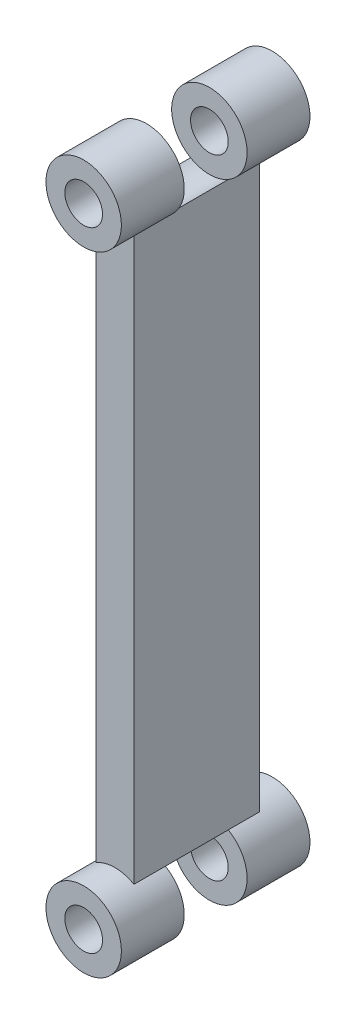
ISO-10303-21;
HEADER;
FILE_DESCRIPTION(('STEP AP214'),'2;1');
FILE_NAME('part.step','',(''),(''),'','','');
FILE_SCHEMA(('AUTOMOTIVE_DESIGN { 1 0 10303 214 1 1 1 1 }'));
ENDSEC;
DATA;
#1=APPLICATION_CONTEXT('core data for automotive mechanical design processes');
#2=APPLICATION_PROTOCOL_DEFINITION('international standard','automotive_design',2000,#1);
#3=PRODUCT_CONTEXT('',#1,'mechanical');
#4=PRODUCT('Part','Part','',(#3));
#5=PRODUCT_RELATED_PRODUCT_CATEGORY('part','',(#4));
#6=PRODUCT_DEFINITION_FORMATION('','',#4);
#7=PRODUCT_DEFINITION_CONTEXT('part definition',#1,'design');
#8=PRODUCT_DEFINITION('design','',#6,#7);
#9=PRODUCT_DEFINITION_SHAPE('','',#8);
#10=(LENGTH_UNIT() NAMED_UNIT(*) SI_UNIT(.MILLI.,.METRE.));
#11=(NAMED_UNIT(*) PLANE_ANGLE_UNIT() SI_UNIT($,.RADIAN.));
#12=(NAMED_UNIT(*) SI_UNIT($,.STERADIAN.) SOLID_ANGLE_UNIT());
#13=UNCERTAINTY_MEASURE_WITH_UNIT(LENGTH_MEASURE(1.E-05),#10,'distance_accuracy_value','');
#14=(GEOMETRIC_REPRESENTATION_CONTEXT(3) GLOBAL_UNCERTAINTY_ASSIGNED_CONTEXT((#13)) GLOBAL_UNIT_ASSIGNED_CONTEXT((#10,
#11,#12)) REPRESENTATION_CONTEXT('',''));
#15=CARTESIAN_POINT('',(0.,0.,0.));
#16=DIRECTION('',(0.,0.,1.));
#17=DIRECTION('',(1.,0.,0.));
#18=AXIS2_PLACEMENT_3D('',#15,#16,#17);
#19=CARTESIAN_POINT('',(0.,25.,2.5));
#20=DIRECTION('',(0.,0.,1.));
#21=DIRECTION('',(1.,0.,0.));
#22=AXIS2_PLACEMENT_3D('',#19,#20,#21);
#23=PLANE('',#22);
#24=CARTESIAN_POINT('',(0.,25.,2.5));
#25=DIRECTION('',(0.,0.,1.));
#26=DIRECTION('',(1.,0.,0.));
#27=AXIS2_PLACEMENT_3D('',#24,#25,#26);
#28=CIRCLE('',#27,3.);
#29=CARTESIAN_POINT('',(-1.5,22.4019237886467,2.5));
#30=VERTEX_POINT('',#29);
#31=CARTESIAN_POINT('',(1.5,22.4019237886467,2.5));
#32=VERTEX_POINT('',#31);
#33=EDGE_CURVE('E209',#30,#32,#28,.T.);
#34=ORIENTED_EDGE('',*,*,#33,.F.);
#35=EDGE_CURVE('E212',#32,#30,#28,.T.);
#36=ORIENTED_EDGE('',*,*,#35,.F.);
#37=EDGE_LOOP('',(#34,#36));
#38=FACE_BOUND('',#37,.T.);
#39=CARTESIAN_POINT('',(0.,25.,2.5));
#40=DIRECTION('',(0.,0.,1.));
#41=DIRECTION('',(1.,0.,0.));
#42=AXIS2_PLACEMENT_3D('',#39,#40,#41);
#43=CIRCLE('',#42,1.5);
#44=CARTESIAN_POINT('',(1.5,25.,2.5));
#45=VERTEX_POINT('',#44);
#46=EDGE_CURVE('E203',#45,#45,#43,.F.);
#47=ORIENTED_EDGE('',*,*,#46,.F.);
#48=EDGE_LOOP('',(#47));
#49=FACE_BOUND('',#48,.T.);
#50=ADVANCED_FACE('F56',(#38,#49),#23,.F.);
#51=CARTESIAN_POINT('',(0.,25.,-2.5));
#52=DIRECTION('',(0.,0.,1.));
#53=DIRECTION('',(1.,0.,0.));
#54=AXIS2_PLACEMENT_3D('',#51,#52,#53);
#55=PLANE('',#54);
#56=CARTESIAN_POINT('',(0.,25.,-2.5));
#57=DIRECTION('',(0.,0.,1.));
#58=DIRECTION('',(1.,0.,0.));
#59=AXIS2_PLACEMENT_3D('',#56,#57,#58);
#60=CIRCLE('',#59,3.);
#61=CARTESIAN_POINT('',(-1.5,22.4019237886467,-2.5));
#62=VERTEX_POINT('',#61);
#63=CARTESIAN_POINT('',(1.5,22.4019237886467,-2.5));
#64=VERTEX_POINT('',#63);
#65=EDGE_CURVE('E77',#62,#64,#60,.T.);
#66=ORIENTED_EDGE('',*,*,#65,.T.);
#67=EDGE_CURVE('E214',#64,#62,#60,.T.);
#68=ORIENTED_EDGE('',*,*,#67,.T.);
#69=EDGE_LOOP('',(#66,#68));
#70=FACE_BOUND('',#69,.T.);
#71=CARTESIAN_POINT('',(0.,25.,-2.5));
#72=DIRECTION('',(0.,0.,1.));
#73=DIRECTION('',(1.,0.,0.));
#74=AXIS2_PLACEMENT_3D('',#71,#72,#73);
#75=CIRCLE('',#74,1.5);
#76=CARTESIAN_POINT('',(1.5,25.,-2.5));
#77=VERTEX_POINT('',#76);
#78=EDGE_CURVE('E206',#77,#77,#75,.F.);
#79=ORIENTED_EDGE('',*,*,#78,.T.);
#80=EDGE_LOOP('',(#79));
#81=FACE_BOUND('',#80,.T.);
#82=ADVANCED_FACE('F227',(#70,#81),#55,.T.);
#83=CARTESIAN_POINT('',(0.,-25.,2.5));
#84=DIRECTION('',(0.,0.,1.));
#85=DIRECTION('',(1.,0.,0.));
#86=AXIS2_PLACEMENT_3D('',#83,#84,#85);
#87=PLANE('',#86);
#88=CARTESIAN_POINT('',(0.,-25.,2.5));
#89=DIRECTION('',(0.,0.,1.));
#90=DIRECTION('',(1.,0.,0.));
#91=AXIS2_PLACEMENT_3D('',#88,#89,#90);
#92=CIRCLE('',#91,3.);
#93=CARTESIAN_POINT('',(1.5,-22.4019237886467,2.5));
#94=VERTEX_POINT('',#93);
#95=CARTESIAN_POINT('',(-1.5,-22.4019237886467,2.5));
#96=VERTEX_POINT('',#95);
#97=EDGE_CURVE('E126',#94,#96,#92,.T.);
#98=ORIENTED_EDGE('',*,*,#97,.F.);
#99=EDGE_CURVE('E220',#96,#94,#92,.T.);
#100=ORIENTED_EDGE('',*,*,#99,.F.);
#101=EDGE_LOOP('',(#98,#100));
#102=FACE_BOUND('',#101,.T.);
#103=CARTESIAN_POINT('',(0.,-25.,2.5));
#104=DIRECTION('',(0.,0.,1.));
#105=DIRECTION('',(1.,0.,0.));
#106=AXIS2_PLACEMENT_3D('',#103,#104,#105);
#107=CIRCLE('',#106,1.50000000000001);
#108=CARTESIAN_POINT('',(1.50000000000001,-25.,2.5));
#109=VERTEX_POINT('',#108);
#110=EDGE_CURVE('E215',#109,#109,#107,.F.);
#111=ORIENTED_EDGE('',*,*,#110,.F.);
#112=EDGE_LOOP('',(#111));
#113=FACE_BOUND('',#112,.T.);
#114=ADVANCED_FACE('F224',(#102,#113),#87,.F.);
#115=CARTESIAN_POINT('',(0.,-25.,-2.5));
#116=DIRECTION('',(0.,0.,1.));
#117=DIRECTION('',(1.,0.,0.));
#118=AXIS2_PLACEMENT_3D('',#115,#116,#117);
#119=PLANE('',#118);
#120=CARTESIAN_POINT('',(0.,-25.,-2.5));
#121=DIRECTION('',(0.,0.,1.));
#122=DIRECTION('',(1.,0.,0.));
#123=AXIS2_PLACEMENT_3D('',#120,#121,#122);
#124=CIRCLE('',#123,3.);
#125=CARTESIAN_POINT('',(1.5,-22.4019237886467,-2.5));
#126=VERTEX_POINT('',#125);
#127=CARTESIAN_POINT('',(-1.5,-22.4019237886467,-2.5));
#128=VERTEX_POINT('',#127);
#129=EDGE_CURVE('E70',#126,#128,#124,.T.);
#130=ORIENTED_EDGE('',*,*,#129,.T.);
#131=EDGE_CURVE('E119',#128,#126,#124,.T.);
#132=ORIENTED_EDGE('',*,*,#131,.T.);
#133=EDGE_LOOP('',(#130,#132));
#134=FACE_BOUND('',#133,.T.);
#135=CARTESIAN_POINT('',(0.,-25.,-2.5));
#136=DIRECTION('',(0.,0.,1.));
#137=DIRECTION('',(1.,0.,0.));
#138=AXIS2_PLACEMENT_3D('',#135,#136,#137);
#139=CIRCLE('',#138,1.50000000000001);
#140=CARTESIAN_POINT('',(1.50000000000001,-25.,-2.5));
#141=VERTEX_POINT('',#140);
#142=EDGE_CURVE('E136',#141,#141,#139,.F.);
#143=ORIENTED_EDGE('',*,*,#142,.T.);
#144=EDGE_LOOP('',(#143));
#145=FACE_BOUND('',#144,.T.);
#146=ADVANCED_FACE('F120',(#134,#145),#119,.T.);
#147=CARTESIAN_POINT('',(0.,-25.,-7.5));
#148=DIRECTION('',(0.,0.,1.));
#149=DIRECTION('',(1.,0.,0.));
#150=AXIS2_PLACEMENT_3D('',#147,#148,#149);
#151=CYLINDRICAL_SURFACE('',#150,3.);
#152=CARTESIAN_POINT('',(0.,-25.,-7.5));
#153=DIRECTION('',(0.,0.,1.));
#154=DIRECTION('',(1.,0.,0.));
#155=AXIS2_PLACEMENT_3D('',#152,#153,#154);
#156=CIRCLE('',#155,3.);
#157=CARTESIAN_POINT('',(3.,-25.,-7.5));
#158=VERTEX_POINT('',#157);
#159=EDGE_CURVE('E161',#158,#158,#156,.T.);
#160=ORIENTED_EDGE('',*,*,#159,.T.);
#161=EDGE_LOOP('',(#160));
#162=FACE_BOUND('',#161,.T.);
#163=DIRECTION('',(0.,0.,1.));
#164=VECTOR('',#163,1.);
#165=CARTESIAN_POINT('',(1.5,-22.4019237886467,-7.5));
#166=LINE('',#165,#164);
#167=CARTESIAN_POINT('',(1.5,-22.4019237886467,-5.));
#168=VERTEX_POINT('',#167);
#169=EDGE_CURVE('E141',#168,#126,#166,.T.);
#170=ORIENTED_EDGE('',*,*,#169,.T.);
#171=ORIENTED_EDGE('',*,*,#131,.F.);
#172=DIRECTION('',(0.,0.,1.));
#173=VECTOR('',#172,1.);
#174=CARTESIAN_POINT('',(-1.5,-22.4019237886467,-7.5));
#175=LINE('',#174,#173);
#176=CARTESIAN_POINT('',(-1.5,-22.4019237886467,-5.));
#177=VERTEX_POINT('',#176);
#178=EDGE_CURVE('E152',#177,#128,#175,.T.);
#179=ORIENTED_EDGE('',*,*,#178,.F.);
#180=CARTESIAN_POINT('',(0.,-25.,-5.));
#181=DIRECTION('',(0.,0.,1.));
#182=DIRECTION('',(1.,0.,0.));
#183=AXIS2_PLACEMENT_3D('',#180,#181,#182);
#184=CIRCLE('',#183,3.);
#185=EDGE_CURVE('E148',#168,#177,#184,.T.);
#186=ORIENTED_EDGE('',*,*,#185,.F.);
#187=EDGE_LOOP('',(#170,#171,#179,#186));
#188=FACE_BOUND('',#187,.T.);
#189=ADVANCED_FACE('F147',(#162,#188),#151,.T.);
#190=CARTESIAN_POINT('',(0.,-25.,-7.5));
#191=DIRECTION('',(0.,0.,1.));
#192=DIRECTION('',(1.,0.,0.));
#193=AXIS2_PLACEMENT_3D('',#190,#191,#192);
#194=CYLINDRICAL_SURFACE('',#193,1.50000000000001);
#195=ORIENTED_EDGE('',*,*,#142,.F.);
#196=EDGE_LOOP('',(#195));
#197=FACE_BOUND('',#196,.T.);
#198=CARTESIAN_POINT('',(0.,-25.,-7.5));
#199=DIRECTION('',(0.,0.,1.));
#200=DIRECTION('',(1.,0.,0.));
#201=AXIS2_PLACEMENT_3D('',#198,#199,#200);
#202=CIRCLE('',#201,1.50000000000001);
#203=CARTESIAN_POINT('',(1.50000000000001,-25.,-7.5));
#204=VERTEX_POINT('',#203);
#205=EDGE_CURVE('E166',#204,#204,#202,.T.);
#206=ORIENTED_EDGE('',*,*,#205,.F.);
#207=EDGE_LOOP('',(#206));
#208=FACE_BOUND('',#207,.T.);
#209=ADVANCED_FACE('F236',(#197,#208),#194,.F.);
#210=CARTESIAN_POINT('',(0.,25.,-7.5));
#211=DIRECTION('',(0.,0.,1.));
#212=DIRECTION('',(1.,0.,0.));
#213=AXIS2_PLACEMENT_3D('',#210,#211,#212);
#214=CYLINDRICAL_SURFACE('',#213,3.);
#215=CARTESIAN_POINT('',(0.,25.,-7.5));
#216=DIRECTION('',(0.,0.,1.));
#217=DIRECTION('',(1.,0.,0.));
#218=AXIS2_PLACEMENT_3D('',#215,#216,#217);
#219=CIRCLE('',#218,3.);
#220=CARTESIAN_POINT('',(3.,25.,-7.5));
#221=VERTEX_POINT('',#220);
#222=EDGE_CURVE('E200',#221,#221,#219,.T.);
#223=ORIENTED_EDGE('',*,*,#222,.T.);
#224=EDGE_LOOP('',(#223));
#225=FACE_BOUND('',#224,.T.);
#226=DIRECTION('',(0.,0.,1.));
#227=VECTOR('',#226,1.);
#228=CARTESIAN_POINT('',(-1.5,22.4019237886467,-7.5));
#229=LINE('',#228,#227);
#230=CARTESIAN_POINT('',(-1.5,22.4019237886467,-5.));
#231=VERTEX_POINT('',#230);
#232=EDGE_CURVE('E190',#62,#231,#229,.F.);
#233=ORIENTED_EDGE('',*,*,#232,.F.);
#234=ORIENTED_EDGE('',*,*,#67,.F.);
#235=DIRECTION('',(0.,0.,1.));
#236=VECTOR('',#235,1.);
#237=CARTESIAN_POINT('',(1.5,22.4019237886467,-7.5));
#238=LINE('',#237,#236);
#239=CARTESIAN_POINT('',(1.5,22.4019237886467,-5.));
#240=VERTEX_POINT('',#239);
#241=EDGE_CURVE('E185',#64,#240,#238,.F.);
#242=ORIENTED_EDGE('',*,*,#241,.T.);
#243=CARTESIAN_POINT('',(0.,25.,-5.));
#244=DIRECTION('',(0.,0.,1.));
#245=DIRECTION('',(1.,0.,0.));
#246=AXIS2_PLACEMENT_3D('',#243,#244,#245);
#247=CIRCLE('',#246,3.);
#248=EDGE_CURVE('E178',#231,#240,#247,.T.);
#249=ORIENTED_EDGE('',*,*,#248,.F.);
#250=EDGE_LOOP('',(#233,#234,#242,#249));
#251=FACE_BOUND('',#250,.T.);
#252=ADVANCED_FACE('F248',(#225,#251),#214,.T.);
#253=CARTESIAN_POINT('',(0.,25.,-7.5));
#254=DIRECTION('',(0.,0.,1.));
#255=DIRECTION('',(1.,0.,0.));
#256=AXIS2_PLACEMENT_3D('',#253,#254,#255);
#257=CYLINDRICAL_SURFACE('',#256,1.5);
#258=ORIENTED_EDGE('',*,*,#78,.F.);
#259=EDGE_LOOP('',(#258));
#260=FACE_BOUND('',#259,.T.);
#261=CARTESIAN_POINT('',(0.,25.,-7.5));
#262=DIRECTION('',(0.,0.,1.));
#263=DIRECTION('',(1.,0.,0.));
#264=AXIS2_PLACEMENT_3D('',#261,#262,#263);
#265=CIRCLE('',#264,1.5);
#266=CARTESIAN_POINT('',(1.5,25.,-7.5));
#267=VERTEX_POINT('',#266);
#268=EDGE_CURVE('E197',#267,#267,#265,.T.);
#269=ORIENTED_EDGE('',*,*,#268,.F.);
#270=EDGE_LOOP('',(#269));
#271=FACE_BOUND('',#270,.T.);
#272=ADVANCED_FACE('F278',(#260,#271),#257,.F.);
#273=CARTESIAN_POINT('',(1.5,-25.,-5.));
#274=DIRECTION('',(1.,0.,0.));
#275=DIRECTION('',(0.,1.,0.));
#276=AXIS2_PLACEMENT_3D('',#273,#274,#275);
#277=PLANE('',#276);
#278=CARTESIAN_POINT('',(1.5,22.4019237886467,5.));
#279=VERTEX_POINT('',#278);
#280=EDGE_CURVE('E181',#279,#32,#238,.F.);
#281=ORIENTED_EDGE('',*,*,#280,.F.);
#282=DIRECTION('',(0.,1.,0.));
#283=VECTOR('',#282,1.);
#284=CARTESIAN_POINT('',(1.5,-25.,5.));
#285=LINE('',#284,#283);
#286=CARTESIAN_POINT('',(1.5,-22.4019237886467,5.));
#287=VERTEX_POINT('',#286);
#288=EDGE_CURVE('E149',#287,#279,#285,.T.);
#289=ORIENTED_EDGE('',*,*,#288,.F.);
#290=EDGE_CURVE('E144',#94,#287,#166,.T.);
#291=ORIENTED_EDGE('',*,*,#290,.F.);
#292=EDGE_CURVE('E132',#126,#94,#166,.T.);
#293=ORIENTED_EDGE('',*,*,#292,.F.);
#294=ORIENTED_EDGE('',*,*,#169,.F.);
#295=DIRECTION('',(0.,1.,0.));
#296=VECTOR('',#295,1.);
#297=CARTESIAN_POINT('',(1.5,-25.,-5.));
#298=LINE('',#297,#296);
#299=EDGE_CURVE('E416',#168,#240,#298,.T.);
#300=ORIENTED_EDGE('',*,*,#299,.T.);
#301=ORIENTED_EDGE('',*,*,#241,.F.);
#302=EDGE_CURVE('E184',#32,#64,#238,.F.);
#303=ORIENTED_EDGE('',*,*,#302,.F.);
#304=EDGE_LOOP('',(#281,#289,#291,#293,#294,#300,#301,#303));
#305=FACE_BOUND('',#304,.T.);
#306=ADVANCED_FACE('F58',(#305),#277,.T.);
#307=CARTESIAN_POINT('',(-1.5,-25.,-5.));
#308=DIRECTION('',(1.,0.,0.));
#309=DIRECTION('',(0.,0.,-1.));
#310=AXIS2_PLACEMENT_3D('',#307,#308,#309);
#311=PLANE('',#310);
#312=DIRECTION('',(0.,1.,0.));
#313=VECTOR('',#312,1.);
#314=CARTESIAN_POINT('',(-1.5,-25.,5.));
#315=LINE('',#314,#313);
#316=CARTESIAN_POINT('',(-1.5,-22.4019237886467,5.));
#317=VERTEX_POINT('',#316);
#318=CARTESIAN_POINT('',(-1.5,22.4019237886467,5.));
#319=VERTEX_POINT('',#318);
#320=EDGE_CURVE('E413',#317,#319,#315,.T.);
#321=ORIENTED_EDGE('',*,*,#320,.T.);
#322=EDGE_CURVE('E186',#319,#30,#229,.F.);
#323=ORIENTED_EDGE('',*,*,#322,.T.);
#324=EDGE_CURVE('E189',#30,#62,#229,.F.);
#325=ORIENTED_EDGE('',*,*,#324,.T.);
#326=ORIENTED_EDGE('',*,*,#232,.T.);
#327=DIRECTION('',(0.,1.,0.));
#328=VECTOR('',#327,1.);
#329=CARTESIAN_POINT('',(-1.5,-25.,-5.));
#330=LINE('',#329,#328);
#331=EDGE_CURVE('E427',#177,#231,#330,.T.);
#332=ORIENTED_EDGE('',*,*,#331,.F.);
#333=ORIENTED_EDGE('',*,*,#178,.T.);
#334=EDGE_CURVE('E135',#128,#96,#175,.T.);
#335=ORIENTED_EDGE('',*,*,#334,.T.);
#336=EDGE_CURVE('E157',#96,#317,#175,.T.);
#337=ORIENTED_EDGE('',*,*,#336,.T.);
#338=EDGE_LOOP('',(#321,#323,#325,#326,#332,#333,#335,#337));
#339=FACE_BOUND('',#338,.T.);
#340=ADVANCED_FACE('F408',(#339),#311,.F.);
#341=CARTESIAN_POINT('',(0.,0.,-5.));
#342=DIRECTION('',(0.,0.,1.));
#343=DIRECTION('',(1.,0.,0.));
#344=AXIS2_PLACEMENT_3D('',#341,#342,#343);
#345=PLANE('',#344);
#346=ORIENTED_EDGE('',*,*,#331,.T.);
#347=ORIENTED_EDGE('',*,*,#248,.T.);
#348=ORIENTED_EDGE('',*,*,#299,.F.);
#349=ORIENTED_EDGE('',*,*,#185,.T.);
#350=EDGE_LOOP('',(#346,#347,#348,#349));
#351=FACE_BOUND('',#350,.T.);
#352=ADVANCED_FACE('F405',(#351),#345,.F.);
#353=CARTESIAN_POINT('',(0.,0.,5.));
#354=DIRECTION('',(0.,0.,1.));
#355=DIRECTION('',(1.,0.,0.));
#356=AXIS2_PLACEMENT_3D('',#353,#354,#355);
#357=PLANE('',#356);
#358=CARTESIAN_POINT('',(0.,25.,5.));
#359=DIRECTION('',(0.,0.,1.));
#360=DIRECTION('',(1.,0.,0.));
#361=AXIS2_PLACEMENT_3D('',#358,#359,#360);
#362=CIRCLE('',#361,3.);
#363=EDGE_CURVE('E12',#319,#279,#362,.T.);
#364=ORIENTED_EDGE('',*,*,#363,.F.);
#365=ORIENTED_EDGE('',*,*,#320,.F.);
#366=CARTESIAN_POINT('',(0.,-25.,5.));
#367=DIRECTION('',(0.,0.,1.));
#368=DIRECTION('',(1.,0.,0.));
#369=AXIS2_PLACEMENT_3D('',#366,#367,#368);
#370=CIRCLE('',#369,3.);
#371=EDGE_CURVE('E64',#287,#317,#370,.T.);
#372=ORIENTED_EDGE('',*,*,#371,.F.);
#373=ORIENTED_EDGE('',*,*,#288,.T.);
#374=EDGE_LOOP('',(#364,#365,#372,#373));
#375=FACE_BOUND('',#374,.T.);
#376=ADVANCED_FACE('F244',(#375),#357,.T.);
#377=ORIENTED_EDGE('',*,*,#99,.T.);
#378=ORIENTED_EDGE('',*,*,#290,.T.);
#379=ORIENTED_EDGE('',*,*,#371,.T.);
#380=ORIENTED_EDGE('',*,*,#336,.F.);
#381=EDGE_LOOP('',(#377,#378,#379,#380));
#382=FACE_BOUND('',#381,.T.);
#383=CARTESIAN_POINT('',(0.,-25.,7.5));
#384=DIRECTION('',(0.,0.,1.));
#385=DIRECTION('',(1.,0.,0.));
#386=AXIS2_PLACEMENT_3D('',#383,#384,#385);
#387=CIRCLE('',#386,3.);
#388=CARTESIAN_POINT('',(3.,-25.,7.5));
#389=VERTEX_POINT('',#388);
#390=EDGE_CURVE('E170',#389,#389,#387,.T.);
#391=ORIENTED_EDGE('',*,*,#390,.F.);
#392=EDGE_LOOP('',(#391));
#393=FACE_BOUND('',#392,.T.);
#394=ADVANCED_FACE('F221',(#382,#393),#151,.T.);
#395=CARTESIAN_POINT('',(0.,-25.,7.5));
#396=DIRECTION('',(0.,0.,1.));
#397=DIRECTION('',(1.,0.,0.));
#398=AXIS2_PLACEMENT_3D('',#395,#396,#397);
#399=CIRCLE('',#398,1.50000000000001);
#400=CARTESIAN_POINT('',(1.50000000000001,-25.,7.5));
#401=VERTEX_POINT('',#400);
#402=EDGE_CURVE('E175',#401,#401,#399,.T.);
#403=ORIENTED_EDGE('',*,*,#402,.T.);
#404=EDGE_LOOP('',(#403));
#405=FACE_BOUND('',#404,.T.);
#406=ORIENTED_EDGE('',*,*,#110,.T.);
#407=EDGE_LOOP('',(#406));
#408=FACE_BOUND('',#407,.T.);
#409=ADVANCED_FACE('F231',(#405,#408),#194,.F.);
#410=CARTESIAN_POINT('',(0.,-25.,-7.5));
#411=DIRECTION('',(0.,0.,1.));
#412=DIRECTION('',(1.,0.,0.));
#413=AXIS2_PLACEMENT_3D('',#410,#411,#412);
#414=PLANE('',#413);
#415=ORIENTED_EDGE('',*,*,#205,.T.);
#416=EDGE_LOOP('',(#415));
#417=FACE_BOUND('',#416,.T.);
#418=ORIENTED_EDGE('',*,*,#159,.F.);
#419=EDGE_LOOP('',(#418));
#420=FACE_BOUND('',#419,.T.);
#421=ADVANCED_FACE('F233',(#417,#420),#414,.F.);
#422=CARTESIAN_POINT('',(0.,-25.,7.5));
#423=DIRECTION('',(0.,0.,1.));
#424=DIRECTION('',(1.,0.,0.));
#425=AXIS2_PLACEMENT_3D('',#422,#423,#424);
#426=PLANE('',#425);
#427=ORIENTED_EDGE('',*,*,#390,.T.);
#428=EDGE_LOOP('',(#427));
#429=FACE_BOUND('',#428,.T.);
#430=ORIENTED_EDGE('',*,*,#402,.F.);
#431=EDGE_LOOP('',(#430));
#432=FACE_BOUND('',#431,.T.);
#433=ADVANCED_FACE('F241',(#429,#432),#426,.T.);
#434=ORIENTED_EDGE('',*,*,#35,.T.);
#435=ORIENTED_EDGE('',*,*,#322,.F.);
#436=ORIENTED_EDGE('',*,*,#363,.T.);
#437=ORIENTED_EDGE('',*,*,#280,.T.);
#438=EDGE_LOOP('',(#434,#435,#436,#437));
#439=FACE_BOUND('',#438,.T.);
#440=CARTESIAN_POINT('',(0.,25.,7.5));
#441=DIRECTION('',(0.,0.,1.));
#442=DIRECTION('',(1.,0.,0.));
#443=AXIS2_PLACEMENT_3D('',#440,#441,#442);
#444=CIRCLE('',#443,3.);
#445=CARTESIAN_POINT('',(3.,25.,7.5));
#446=VERTEX_POINT('',#445);
#447=EDGE_CURVE('E194',#446,#446,#444,.T.);
#448=ORIENTED_EDGE('',*,*,#447,.F.);
#449=EDGE_LOOP('',(#448));
#450=FACE_BOUND('',#449,.T.);
#451=ADVANCED_FACE('F266',(#439,#450),#214,.T.);
#452=CARTESIAN_POINT('',(0.,25.,7.5));
#453=DIRECTION('',(0.,0.,1.));
#454=DIRECTION('',(1.,0.,0.));
#455=AXIS2_PLACEMENT_3D('',#452,#453,#454);
#456=CIRCLE('',#455,1.5);
#457=CARTESIAN_POINT('',(1.5,25.,7.5));
#458=VERTEX_POINT('',#457);
#459=EDGE_CURVE('E191',#458,#458,#456,.T.);
#460=ORIENTED_EDGE('',*,*,#459,.T.);
#461=EDGE_LOOP('',(#460));
#462=FACE_BOUND('',#461,.T.);
#463=ORIENTED_EDGE('',*,*,#46,.T.);
#464=EDGE_LOOP('',(#463));
#465=FACE_BOUND('',#464,.T.);
#466=ADVANCED_FACE('F269',(#462,#465),#257,.F.);
#467=CARTESIAN_POINT('',(0.,25.,-7.5));
#468=DIRECTION('',(0.,0.,1.));
#469=DIRECTION('',(1.,0.,0.));
#470=AXIS2_PLACEMENT_3D('',#467,#468,#469);
#471=PLANE('',#470);
#472=ORIENTED_EDGE('',*,*,#268,.T.);
#473=EDGE_LOOP('',(#472));
#474=FACE_BOUND('',#473,.T.);
#475=ORIENTED_EDGE('',*,*,#222,.F.);
#476=EDGE_LOOP('',(#475));
#477=FACE_BOUND('',#476,.T.);
#478=ADVANCED_FACE('F271',(#474,#477),#471,.F.);
#479=CARTESIAN_POINT('',(0.,25.,7.5));
#480=DIRECTION('',(0.,0.,1.));
#481=DIRECTION('',(1.,0.,0.));
#482=AXIS2_PLACEMENT_3D('',#479,#480,#481);
#483=PLANE('',#482);
#484=ORIENTED_EDGE('',*,*,#447,.T.);
#485=EDGE_LOOP('',(#484));
#486=FACE_BOUND('',#485,.T.);
#487=ORIENTED_EDGE('',*,*,#459,.F.);
#488=EDGE_LOOP('',(#487));
#489=FACE_BOUND('',#488,.T.);
#490=ADVANCED_FACE('F264',(#486,#489),#483,.T.);
#491=CARTESIAN_POINT('',(0.,25.,2.5));
#492=DIRECTION('',(0.,0.,-1.));
#493=DIRECTION('',(-1.,0.,0.));
#494=AXIS2_PLACEMENT_3D('',#491,#492,#493);
#495=CYLINDRICAL_SURFACE('',#494,3.);
#496=ORIENTED_EDGE('',*,*,#65,.F.);
#497=ORIENTED_EDGE('',*,*,#324,.F.);
#498=ORIENTED_EDGE('',*,*,#33,.T.);
#499=ORIENTED_EDGE('',*,*,#302,.T.);
#500=EDGE_LOOP('',(#496,#497,#498,#499));
#501=FACE_BOUND('',#500,.T.);
#502=ADVANCED_FACE('F261',(#501),#495,.F.);
#503=CARTESIAN_POINT('',(0.,-25.,2.5));
#504=DIRECTION('',(0.,0.,-1.));
#505=DIRECTION('',(-1.,0.,0.));
#506=AXIS2_PLACEMENT_3D('',#503,#504,#505);
#507=CYLINDRICAL_SURFACE('',#506,3.);
#508=ORIENTED_EDGE('',*,*,#97,.T.);
#509=ORIENTED_EDGE('',*,*,#334,.F.);
#510=ORIENTED_EDGE('',*,*,#129,.F.);
#511=ORIENTED_EDGE('',*,*,#292,.T.);
#512=EDGE_LOOP('',(#508,#509,#510,#511));
#513=FACE_BOUND('',#512,.T.);
#514=ADVANCED_FACE('F131',(#513),#507,.F.);
#515=CLOSED_SHELL('',(#50,#82,#114,#146,#189,#209,#252,#272,#306,#340,#352,#376,#394,#409,#421,
#433,#451,#466,#478,#490,#502,#514));
#516=MANIFOLD_SOLID_BREP('B2',#515);
#517=ADVANCED_BREP_SHAPE_REPRESENTATION('',(#18,#516),#14);
#518=SHAPE_DEFINITION_REPRESENTATION(#9,#517);
ENDSEC;
END-ISO-10303-21;
